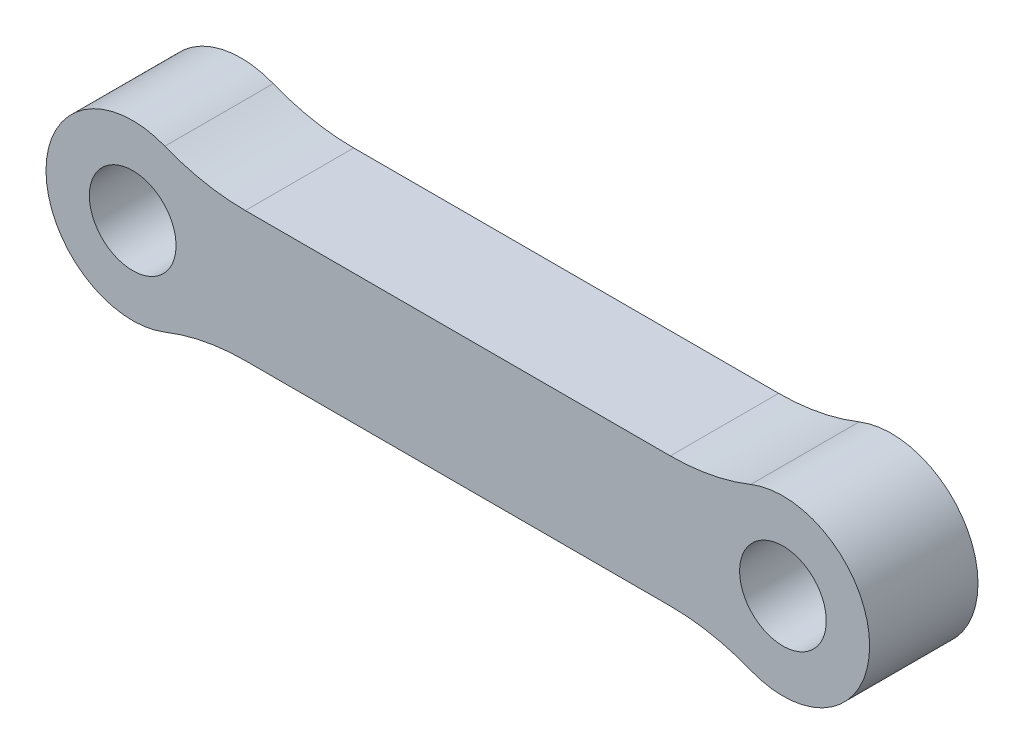
ISO-10303-21;
HEADER;
FILE_DESCRIPTION(('STEP AP214'),'2;1');
FILE_NAME('part.step','',(''),(''),'','','');
FILE_SCHEMA(('AUTOMOTIVE_DESIGN { 1 0 10303 214 1 1 1 1 }'));
ENDSEC;
DATA;
#1=APPLICATION_CONTEXT('core data for automotive mechanical design processes');
#2=APPLICATION_PROTOCOL_DEFINITION('international standard','automotive_design',2000,#1);
#3=PRODUCT_CONTEXT('',#1,'mechanical');
#4=PRODUCT('Part','Part','',(#3));
#5=PRODUCT_RELATED_PRODUCT_CATEGORY('part','',(#4));
#6=PRODUCT_DEFINITION_FORMATION('','',#4);
#7=PRODUCT_DEFINITION_CONTEXT('part definition',#1,'design');
#8=PRODUCT_DEFINITION('design','',#6,#7);
#9=PRODUCT_DEFINITION_SHAPE('','',#8);
#10=(LENGTH_UNIT() NAMED_UNIT(*) SI_UNIT(.MILLI.,.METRE.));
#11=(NAMED_UNIT(*) PLANE_ANGLE_UNIT() SI_UNIT($,.RADIAN.));
#12=(NAMED_UNIT(*) SI_UNIT($,.STERADIAN.) SOLID_ANGLE_UNIT());
#13=UNCERTAINTY_MEASURE_WITH_UNIT(LENGTH_MEASURE(1.E-05),#10,'distance_accuracy_value','');
#14=(GEOMETRIC_REPRESENTATION_CONTEXT(3) GLOBAL_UNCERTAINTY_ASSIGNED_CONTEXT((#13)) GLOBAL_UNIT_ASSIGNED_CONTEXT((#10,
#11,#12)) REPRESENTATION_CONTEXT('',''));
#15=CARTESIAN_POINT('',(0.,0.,0.));
#16=DIRECTION('',(0.,0.,1.));
#17=DIRECTION('',(1.,0.,0.));
#18=AXIS2_PLACEMENT_3D('',#15,#16,#17);
#19=CARTESIAN_POINT('',(0.,0.,5.));
#20=DIRECTION('',(0.,0.,1.));
#21=DIRECTION('',(1.,0.,0.));
#22=AXIS2_PLACEMENT_3D('',#19,#20,#21);
#23=PLANE('',#22);
#24=CARTESIAN_POINT('',(-35.5986281200708,13.3138549490649,5.));
#25=DIRECTION('',(0.,0.,-1.));
#26=DIRECTION('',(-1.,0.,0.));
#27=AXIS2_PLACEMENT_3D('',#24,#25,#26);
#28=CIRCLE('',#27,4.);
#29=CARTESIAN_POINT('',(-34.1140131421546,9.59956923477921,5.));
#30=VERTEX_POINT('',#29);
#31=CARTESIAN_POINT('',(-34.1140131421546,17.0281406633506,5.));
#32=VERTEX_POINT('',#31);
#33=EDGE_CURVE('E109',#30,#32,#28,.T.);
#34=ORIENTED_EDGE('',*,*,#33,.F.);
#35=CARTESIAN_POINT('',(-30.4024756973641,0.313854949064921,5.));
#36=DIRECTION('',(0.,0.,-1.));
#37=DIRECTION('',(-1.,0.,0.));
#38=AXIS2_PLACEMENT_3D('',#35,#36,#37);
#39=CIRCLE('',#38,10.);
#40=CARTESIAN_POINT('',(-30.4024756973641,10.3138549490649,5.));
#41=VERTEX_POINT('',#40);
#42=EDGE_CURVE('E105',#30,#41,#39,.T.);
#43=ORIENTED_EDGE('',*,*,#42,.T.);
#44=DIRECTION('',(1.,0.,0.));
#45=VECTOR('',#44,1.);
#46=CARTESIAN_POINT('',(0.,10.3138549490649,5.));
#47=LINE('',#46,#45);
#48=CARTESIAN_POINT('',(-10.7947805427774,10.3138549490649,5.));
#49=VERTEX_POINT('',#48);
#50=EDGE_CURVE('E263',#41,#49,#47,.T.);
#51=ORIENTED_EDGE('',*,*,#50,.T.);
#52=CARTESIAN_POINT('',(-10.7947805427774,0.313854949064921,5.));
#53=DIRECTION('',(0.,0.,-1.));
#54=DIRECTION('',(-1.,0.,0.));
#55=AXIS2_PLACEMENT_3D('',#52,#53,#54);
#56=CIRCLE('',#55,10.);
#57=CARTESIAN_POINT('',(-7.08324309798695,9.59956923477921,5.));
#58=VERTEX_POINT('',#57);
#59=EDGE_CURVE('E97',#49,#58,#56,.T.);
#60=ORIENTED_EDGE('',*,*,#59,.T.);
#61=CARTESIAN_POINT('',(-5.59862812007077,13.3138549490649,5.));
#62=DIRECTION('',(0.,0.,-1.));
#63=DIRECTION('',(-1.,0.,0.));
#64=AXIS2_PLACEMENT_3D('',#61,#62,#63);
#65=CIRCLE('',#64,4.);
#66=CARTESIAN_POINT('',(-7.08324309798694,17.0281406633506,5.));
#67=VERTEX_POINT('',#66);
#68=EDGE_CURVE('E91',#67,#58,#65,.T.);
#69=ORIENTED_EDGE('',*,*,#68,.F.);
#70=CARTESIAN_POINT('',(-10.7947805427774,26.3138549490649,5.));
#71=DIRECTION('',(0.,0.,-1.));
#72=DIRECTION('',(-1.,0.,0.));
#73=AXIS2_PLACEMENT_3D('',#70,#71,#72);
#74=CIRCLE('',#73,10.);
#75=CARTESIAN_POINT('',(-10.7947805427774,16.3138549490649,5.));
#76=VERTEX_POINT('',#75);
#77=EDGE_CURVE('E79',#67,#76,#74,.T.);
#78=ORIENTED_EDGE('',*,*,#77,.T.);
#79=DIRECTION('',(1.,0.,0.));
#80=VECTOR('',#79,1.);
#81=CARTESIAN_POINT('',(0.,16.3138549490649,5.));
#82=LINE('',#81,#80);
#83=CARTESIAN_POINT('',(-30.4024756973641,16.3138549490649,5.));
#84=VERTEX_POINT('',#83);
#85=EDGE_CURVE('E87',#84,#76,#82,.T.);
#86=ORIENTED_EDGE('',*,*,#85,.F.);
#87=CARTESIAN_POINT('',(-30.4024756973641,26.3138549490649,5.));
#88=DIRECTION('',(0.,0.,-1.));
#89=DIRECTION('',(-1.,0.,0.));
#90=AXIS2_PLACEMENT_3D('',#87,#88,#89);
#91=CIRCLE('',#90,10.);
#92=EDGE_CURVE('E112',#84,#32,#91,.T.);
#93=ORIENTED_EDGE('',*,*,#92,.T.);
#94=EDGE_LOOP('',(#34,#43,#51,#60,#69,#78,#86,#93));
#95=FACE_BOUND('',#94,.T.);
#96=CARTESIAN_POINT('',(-5.59862812007077,13.3138549490649,5.));
#97=DIRECTION('',(0.,0.,-1.));
#98=DIRECTION('',(-1.,0.,0.));
#99=AXIS2_PLACEMENT_3D('',#96,#97,#98);
#100=CIRCLE('',#99,2.);
#101=CARTESIAN_POINT('',(-7.59862812007077,13.3138549490649,5.));
#102=VERTEX_POINT('',#101);
#103=EDGE_CURVE('E88',#102,#102,#100,.T.);
#104=ORIENTED_EDGE('',*,*,#103,.T.);
#105=EDGE_LOOP('',(#104));
#106=FACE_BOUND('',#105,.T.);
#107=CARTESIAN_POINT('',(-35.5986281200708,13.3138549490649,5.));
#108=DIRECTION('',(0.,0.,-1.));
#109=DIRECTION('',(-1.,0.,0.));
#110=AXIS2_PLACEMENT_3D('',#107,#108,#109);
#111=CIRCLE('',#110,2.);
#112=CARTESIAN_POINT('',(-37.5986281200708,13.3138549490649,5.));
#113=VERTEX_POINT('',#112);
#114=EDGE_CURVE('E20',#113,#113,#111,.T.);
#115=ORIENTED_EDGE('',*,*,#114,.T.);
#116=EDGE_LOOP('',(#115));
#117=FACE_BOUND('',#116,.T.);
#118=ADVANCED_FACE('F17',(#95,#106,#117),#23,.T.);
#119=CARTESIAN_POINT('',(-35.5986281200708,13.3138549490649,5.));
#120=DIRECTION('',(0.,0.,-1.));
#121=DIRECTION('',(-1.,0.,0.));
#122=AXIS2_PLACEMENT_3D('',#119,#120,#121);
#123=CYLINDRICAL_SURFACE('',#122,2.);
#124=CARTESIAN_POINT('',(-35.5986281200708,13.3138549490649,0.));
#125=DIRECTION('',(0.,0.,-1.));
#126=DIRECTION('',(-1.,0.,0.));
#127=AXIS2_PLACEMENT_3D('',#124,#125,#126);
#128=CIRCLE('',#127,2.);
#129=CARTESIAN_POINT('',(-37.5986281200708,13.3138549490649,0.));
#130=VERTEX_POINT('',#129);
#131=EDGE_CURVE('E93',#130,#130,#128,.T.);
#132=ORIENTED_EDGE('',*,*,#131,.T.);
#133=EDGE_LOOP('',(#132));
#134=FACE_BOUND('',#133,.T.);
#135=ORIENTED_EDGE('',*,*,#114,.F.);
#136=EDGE_LOOP('',(#135));
#137=FACE_BOUND('',#136,.T.);
#138=ADVANCED_FACE('F121',(#134,#137),#123,.F.);
#139=CARTESIAN_POINT('',(-5.59862812007077,13.3138549490649,5.));
#140=DIRECTION('',(0.,0.,-1.));
#141=DIRECTION('',(-1.,0.,0.));
#142=AXIS2_PLACEMENT_3D('',#139,#140,#141);
#143=CYLINDRICAL_SURFACE('',#142,2.);
#144=CARTESIAN_POINT('',(-5.59862812007077,13.3138549490649,0.));
#145=DIRECTION('',(0.,0.,-1.));
#146=DIRECTION('',(-1.,0.,0.));
#147=AXIS2_PLACEMENT_3D('',#144,#145,#146);
#148=CIRCLE('',#147,2.);
#149=CARTESIAN_POINT('',(-7.59862812007077,13.3138549490649,0.));
#150=VERTEX_POINT('',#149);
#151=EDGE_CURVE('E256',#150,#150,#148,.T.);
#152=ORIENTED_EDGE('',*,*,#151,.T.);
#153=EDGE_LOOP('',(#152));
#154=FACE_BOUND('',#153,.T.);
#155=ORIENTED_EDGE('',*,*,#103,.F.);
#156=EDGE_LOOP('',(#155));
#157=FACE_BOUND('',#156,.T.);
#158=ADVANCED_FACE('F123',(#154,#157),#143,.F.);
#159=CARTESIAN_POINT('',(-10.7947805427774,26.3138549490649,5.));
#160=DIRECTION('',(0.,0.,-1.));
#161=DIRECTION('',(-1.,0.,0.));
#162=AXIS2_PLACEMENT_3D('',#159,#160,#161);
#163=CYLINDRICAL_SURFACE('',#162,10.);
#164=DIRECTION('',(0.,0.,-1.));
#165=VECTOR('',#164,1.);
#166=CARTESIAN_POINT('',(-7.08324309798694,17.0281406633506,5.));
#167=LINE('',#166,#165);
#168=CARTESIAN_POINT('',(-7.08324309798694,17.0281406633506,0.));
#169=VERTEX_POINT('',#168);
#170=EDGE_CURVE('E83',#169,#67,#167,.F.);
#171=ORIENTED_EDGE('',*,*,#170,.F.);
#172=CARTESIAN_POINT('',(-10.7947805427774,26.3138549490649,0.));
#173=DIRECTION('',(0.,0.,-1.));
#174=DIRECTION('',(-1.,0.,0.));
#175=AXIS2_PLACEMENT_3D('',#172,#173,#174);
#176=CIRCLE('',#175,10.);
#177=CARTESIAN_POINT('',(-10.7947805427774,16.3138549490649,0.));
#178=VERTEX_POINT('',#177);
#179=EDGE_CURVE('E251',#169,#178,#176,.T.);
#180=ORIENTED_EDGE('',*,*,#179,.T.);
#181=DIRECTION('',(0.,0.,1.));
#182=VECTOR('',#181,1.);
#183=CARTESIAN_POINT('',(-10.7947805427774,16.3138549490649,5.));
#184=LINE('',#183,#182);
#185=EDGE_CURVE('E84',#76,#178,#184,.F.);
#186=ORIENTED_EDGE('',*,*,#185,.F.);
#187=ORIENTED_EDGE('',*,*,#77,.F.);
#188=EDGE_LOOP('',(#171,#180,#186,#187));
#189=FACE_BOUND('',#188,.T.);
#190=ADVANCED_FACE('F81',(#189),#163,.F.);
#191=CARTESIAN_POINT('',(0.,16.3138549490649,5.));
#192=DIRECTION('',(0.,1.,0.));
#193=DIRECTION('',(0.,0.,1.));
#194=AXIS2_PLACEMENT_3D('',#191,#192,#193);
#195=PLANE('',#194);
#196=DIRECTION('',(1.,0.,0.));
#197=VECTOR('',#196,1.);
#198=CARTESIAN_POINT('',(0.,16.3138549490649,0.));
#199=LINE('',#198,#197);
#200=CARTESIAN_POINT('',(-30.4024756973641,16.3138549490649,0.));
#201=VERTEX_POINT('',#200);
#202=EDGE_CURVE('E247',#178,#201,#199,.F.);
#203=ORIENTED_EDGE('',*,*,#202,.T.);
#204=DIRECTION('',(0.,0.,-1.));
#205=VECTOR('',#204,1.);
#206=CARTESIAN_POINT('',(-30.4024756973641,16.3138549490649,5.));
#207=LINE('',#206,#205);
#208=EDGE_CURVE('E114',#201,#84,#207,.F.);
#209=ORIENTED_EDGE('',*,*,#208,.T.);
#210=ORIENTED_EDGE('',*,*,#85,.T.);
#211=ORIENTED_EDGE('',*,*,#185,.T.);
#212=EDGE_LOOP('',(#203,#209,#210,#211));
#213=FACE_BOUND('',#212,.T.);
#214=ADVANCED_FACE('F163',(#213),#195,.T.);
#215=CARTESIAN_POINT('',(-30.4024756973641,26.3138549490649,5.));
#216=DIRECTION('',(0.,0.,-1.));
#217=DIRECTION('',(-1.,0.,0.));
#218=AXIS2_PLACEMENT_3D('',#215,#216,#217);
#219=CYLINDRICAL_SURFACE('',#218,10.);
#220=ORIENTED_EDGE('',*,*,#208,.F.);
#221=CARTESIAN_POINT('',(-30.4024756973641,26.3138549490649,0.));
#222=DIRECTION('',(0.,0.,-1.));
#223=DIRECTION('',(-1.,0.,0.));
#224=AXIS2_PLACEMENT_3D('',#221,#222,#223);
#225=CIRCLE('',#224,10.);
#226=CARTESIAN_POINT('',(-34.1140131421546,17.0281406633506,0.));
#227=VERTEX_POINT('',#226);
#228=EDGE_CURVE('E250',#201,#227,#225,.T.);
#229=ORIENTED_EDGE('',*,*,#228,.T.);
#230=DIRECTION('',(0.,0.,-1.));
#231=VECTOR('',#230,1.);
#232=CARTESIAN_POINT('',(-34.1140131421546,17.0281406633506,5.));
#233=LINE('',#232,#231);
#234=EDGE_CURVE('E111',#32,#227,#233,.T.);
#235=ORIENTED_EDGE('',*,*,#234,.F.);
#236=ORIENTED_EDGE('',*,*,#92,.F.);
#237=EDGE_LOOP('',(#220,#229,#235,#236));
#238=FACE_BOUND('',#237,.T.);
#239=ADVANCED_FACE('F159',(#238),#219,.F.);
#240=CARTESIAN_POINT('',(-35.5986281200708,13.3138549490649,5.));
#241=DIRECTION('',(0.,0.,-1.));
#242=DIRECTION('',(-1.,0.,0.));
#243=AXIS2_PLACEMENT_3D('',#240,#241,#242);
#244=CYLINDRICAL_SURFACE('',#243,4.);
#245=CARTESIAN_POINT('',(-35.5986281200708,13.3138549490649,0.));
#246=DIRECTION('',(0.,0.,-1.));
#247=DIRECTION('',(-1.,0.,0.));
#248=AXIS2_PLACEMENT_3D('',#245,#246,#247);
#249=CIRCLE('',#248,4.);
#250=CARTESIAN_POINT('',(-34.1140131421546,9.59956923477921,0.));
#251=VERTEX_POINT('',#250);
#252=EDGE_CURVE('E254',#227,#251,#249,.F.);
#253=ORIENTED_EDGE('',*,*,#252,.T.);
#254=DIRECTION('',(0.,0.,-1.));
#255=VECTOR('',#254,1.);
#256=CARTESIAN_POINT('',(-34.1140131421546,9.59956923477921,5.));
#257=LINE('',#256,#255);
#258=EDGE_CURVE('E108',#251,#30,#257,.F.);
#259=ORIENTED_EDGE('',*,*,#258,.T.);
#260=ORIENTED_EDGE('',*,*,#33,.T.);
#261=ORIENTED_EDGE('',*,*,#234,.T.);
#262=EDGE_LOOP('',(#253,#259,#260,#261));
#263=FACE_BOUND('',#262,.T.);
#264=ADVANCED_FACE('F155',(#263),#244,.T.);
#265=CARTESIAN_POINT('',(-30.4024756973641,0.313854949064921,5.));
#266=DIRECTION('',(0.,0.,-1.));
#267=DIRECTION('',(-1.,0.,0.));
#268=AXIS2_PLACEMENT_3D('',#265,#266,#267);
#269=CYLINDRICAL_SURFACE('',#268,10.);
#270=ORIENTED_EDGE('',*,*,#258,.F.);
#271=CARTESIAN_POINT('',(-30.4024756973641,0.313854949064921,0.));
#272=DIRECTION('',(0.,0.,-1.));
#273=DIRECTION('',(-1.,0.,0.));
#274=AXIS2_PLACEMENT_3D('',#271,#272,#273);
#275=CIRCLE('',#274,10.);
#276=CARTESIAN_POINT('',(-30.4024756973641,10.3138549490649,0.));
#277=VERTEX_POINT('',#276);
#278=EDGE_CURVE('E275',#251,#277,#275,.T.);
#279=ORIENTED_EDGE('',*,*,#278,.T.);
#280=DIRECTION('',(0.,0.,1.));
#281=VECTOR('',#280,1.);
#282=CARTESIAN_POINT('',(-30.4024756973641,10.3138549490649,5.));
#283=LINE('',#282,#281);
#284=EDGE_CURVE('E107',#277,#41,#283,.T.);
#285=ORIENTED_EDGE('',*,*,#284,.T.);
#286=ORIENTED_EDGE('',*,*,#42,.F.);
#287=EDGE_LOOP('',(#270,#279,#285,#286));
#288=FACE_BOUND('',#287,.T.);
#289=ADVANCED_FACE('F151',(#288),#269,.F.);
#290=CARTESIAN_POINT('',(0.,10.3138549490649,5.));
#291=DIRECTION('',(0.,1.,0.));
#292=DIRECTION('',(0.,0.,1.));
#293=AXIS2_PLACEMENT_3D('',#290,#291,#292);
#294=PLANE('',#293);
#295=DIRECTION('',(0.,0.,-1.));
#296=VECTOR('',#295,1.);
#297=CARTESIAN_POINT('',(-10.7947805427774,10.3138549490649,5.));
#298=LINE('',#297,#296);
#299=CARTESIAN_POINT('',(-10.7947805427774,10.3138549490649,0.));
#300=VERTEX_POINT('',#299);
#301=EDGE_CURVE('E100',#300,#49,#298,.F.);
#302=ORIENTED_EDGE('',*,*,#301,.T.);
#303=ORIENTED_EDGE('',*,*,#50,.F.);
#304=ORIENTED_EDGE('',*,*,#284,.F.);
#305=DIRECTION('',(1.,0.,0.));
#306=VECTOR('',#305,1.);
#307=CARTESIAN_POINT('',(0.,10.3138549490649,0.));
#308=LINE('',#307,#306);
#309=EDGE_CURVE('E259',#277,#300,#308,.T.);
#310=ORIENTED_EDGE('',*,*,#309,.T.);
#311=EDGE_LOOP('',(#302,#303,#304,#310));
#312=FACE_BOUND('',#311,.T.);
#313=ADVANCED_FACE('F147',(#312),#294,.F.);
#314=CARTESIAN_POINT('',(-10.7947805427774,0.313854949064921,5.));
#315=DIRECTION('',(0.,0.,-1.));
#316=DIRECTION('',(-1.,0.,0.));
#317=AXIS2_PLACEMENT_3D('',#314,#315,#316);
#318=CYLINDRICAL_SURFACE('',#317,10.);
#319=ORIENTED_EDGE('',*,*,#301,.F.);
#320=CARTESIAN_POINT('',(-10.7947805427774,0.313854949064921,0.));
#321=DIRECTION('',(0.,0.,-1.));
#322=DIRECTION('',(-1.,0.,0.));
#323=AXIS2_PLACEMENT_3D('',#320,#321,#322);
#324=CIRCLE('',#323,10.);
#325=CARTESIAN_POINT('',(-7.08324309798695,9.59956923477921,0.));
#326=VERTEX_POINT('',#325);
#327=EDGE_CURVE('E26',#300,#326,#324,.T.);
#328=ORIENTED_EDGE('',*,*,#327,.T.);
#329=DIRECTION('',(0.,0.,-1.));
#330=VECTOR('',#329,1.);
#331=CARTESIAN_POINT('',(-7.08324309798695,9.59956923477921,5.));
#332=LINE('',#331,#330);
#333=EDGE_CURVE('E34',#58,#326,#332,.T.);
#334=ORIENTED_EDGE('',*,*,#333,.F.);
#335=ORIENTED_EDGE('',*,*,#59,.F.);
#336=EDGE_LOOP('',(#319,#328,#334,#335));
#337=FACE_BOUND('',#336,.T.);
#338=ADVANCED_FACE('F140',(#337),#318,.F.);
#339=CARTESIAN_POINT('',(-5.59862812007077,13.3138549490649,5.));
#340=DIRECTION('',(0.,0.,-1.));
#341=DIRECTION('',(-1.,0.,0.));
#342=AXIS2_PLACEMENT_3D('',#339,#340,#341);
#343=CYLINDRICAL_SURFACE('',#342,4.);
#344=CARTESIAN_POINT('',(-5.59862812007077,13.3138549490649,0.));
#345=DIRECTION('',(0.,0.,-1.));
#346=DIRECTION('',(-1.,0.,0.));
#347=AXIS2_PLACEMENT_3D('',#344,#345,#346);
#348=CIRCLE('',#347,4.);
#349=EDGE_CURVE('E11',#326,#169,#348,.F.);
#350=ORIENTED_EDGE('',*,*,#349,.T.);
#351=ORIENTED_EDGE('',*,*,#170,.T.);
#352=ORIENTED_EDGE('',*,*,#68,.T.);
#353=ORIENTED_EDGE('',*,*,#333,.T.);
#354=EDGE_LOOP('',(#350,#351,#352,#353));
#355=FACE_BOUND('',#354,.T.);
#356=ADVANCED_FACE('F90',(#355),#343,.T.);
#357=CARTESIAN_POINT('',(0.,0.,0.));
#358=DIRECTION('',(0.,0.,1.));
#359=DIRECTION('',(1.,0.,0.));
#360=AXIS2_PLACEMENT_3D('',#357,#358,#359);
#361=PLANE('',#360);
#362=ORIENTED_EDGE('',*,*,#327,.F.);
#363=ORIENTED_EDGE('',*,*,#309,.F.);
#364=ORIENTED_EDGE('',*,*,#278,.F.);
#365=ORIENTED_EDGE('',*,*,#252,.F.);
#366=ORIENTED_EDGE('',*,*,#228,.F.);
#367=ORIENTED_EDGE('',*,*,#202,.F.);
#368=ORIENTED_EDGE('',*,*,#179,.F.);
#369=ORIENTED_EDGE('',*,*,#349,.F.);
#370=EDGE_LOOP('',(#362,#363,#364,#365,#366,#367,#368,#369));
#371=FACE_BOUND('',#370,.T.);
#372=ORIENTED_EDGE('',*,*,#151,.F.);
#373=EDGE_LOOP('',(#372));
#374=FACE_BOUND('',#373,.T.);
#375=ORIENTED_EDGE('',*,*,#131,.F.);
#376=EDGE_LOOP('',(#375));
#377=FACE_BOUND('',#376,.T.);
#378=ADVANCED_FACE('F133',(#371,#374,#377),#361,.F.);
#379=CLOSED_SHELL('',(#118,#138,#158,#190,#214,#239,#264,#289,#313,#338,#356,#378));
#380=MANIFOLD_SOLID_BREP('B1',#379);
#381=ADVANCED_BREP_SHAPE_REPRESENTATION('',(#18,#380),#14);
#382=SHAPE_DEFINITION_REPRESENTATION(#9,#381);
ENDSEC;
END-ISO-10303-21;
